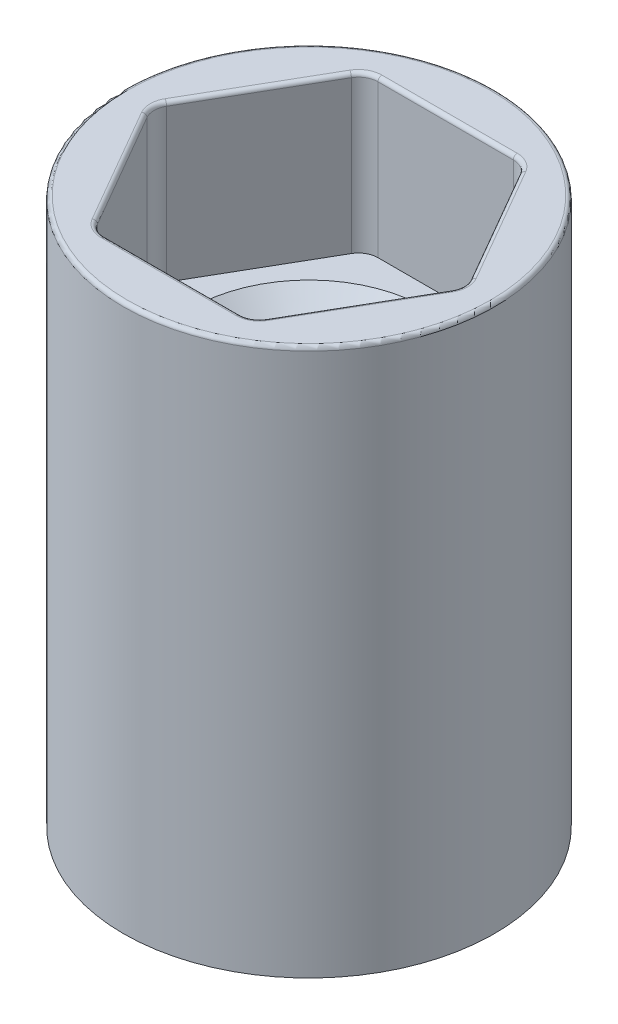
ISO-10303-21;
HEADER;
FILE_DESCRIPTION(('STEP AP214'),'2;1');
FILE_NAME('part.step','',(''),(''),'','','');
FILE_SCHEMA(('AUTOMOTIVE_DESIGN { 1 0 10303 214 1 1 1 1 }'));
ENDSEC;
DATA;
#1=APPLICATION_CONTEXT('core data for automotive mechanical design processes');
#2=APPLICATION_PROTOCOL_DEFINITION('international standard','automotive_design',2000,#1);
#3=PRODUCT_CONTEXT('',#1,'mechanical');
#4=PRODUCT('Part','Part','',(#3));
#5=PRODUCT_RELATED_PRODUCT_CATEGORY('part','',(#4));
#6=PRODUCT_DEFINITION_FORMATION('','',#4);
#7=PRODUCT_DEFINITION_CONTEXT('part definition',#1,'design');
#8=PRODUCT_DEFINITION('design','',#6,#7);
#9=PRODUCT_DEFINITION_SHAPE('','',#8);
#10=(LENGTH_UNIT() NAMED_UNIT(*) SI_UNIT(.MILLI.,.METRE.));
#11=(NAMED_UNIT(*) PLANE_ANGLE_UNIT() SI_UNIT($,.RADIAN.));
#12=(NAMED_UNIT(*) SI_UNIT($,.STERADIAN.) SOLID_ANGLE_UNIT());
#13=UNCERTAINTY_MEASURE_WITH_UNIT(LENGTH_MEASURE(1.E-05),#10,'distance_accuracy_value','');
#14=(GEOMETRIC_REPRESENTATION_CONTEXT(3) GLOBAL_UNCERTAINTY_ASSIGNED_CONTEXT((#13)) GLOBAL_UNIT_ASSIGNED_CONTEXT((#10,
#11,#12)) REPRESENTATION_CONTEXT('',''));
#15=CARTESIAN_POINT('',(0.,0.,0.));
#16=DIRECTION('',(0.,0.,1.));
#17=DIRECTION('',(1.,0.,0.));
#18=AXIS2_PLACEMENT_3D('',#15,#16,#17);
#19=CARTESIAN_POINT('',(0.,14.,0.));
#20=DIRECTION('',(0.,-1.,0.));
#21=DIRECTION('',(0.,0.,-1.));
#22=AXIS2_PLACEMENT_3D('',#19,#20,#21);
#23=CYLINDRICAL_SURFACE('',#22,2.5);
#24=CARTESIAN_POINT('',(0.,9.49999999999999,0.));
#25=DIRECTION('',(0.,1.,0.));
#26=DIRECTION('',(0.,0.,1.));
#27=AXIS2_PLACEMENT_3D('',#24,#25,#26);
#28=CIRCLE('',#27,2.5);
#29=CARTESIAN_POINT('',(0.,9.49999999999999,2.5));
#30=VERTEX_POINT('',#29);
#31=EDGE_CURVE('E223',#30,#30,#28,.T.);
#32=ORIENTED_EDGE('',*,*,#31,.T.);
#33=EDGE_LOOP('',(#32));
#34=FACE_BOUND('',#33,.T.);
#35=CARTESIAN_POINT('',(0.,0.500000000000006,0.));
#36=DIRECTION('',(0.,1.,0.));
#37=DIRECTION('',(0.,0.,1.));
#38=AXIS2_PLACEMENT_3D('',#35,#36,#37);
#39=CIRCLE('',#38,2.5);
#40=CARTESIAN_POINT('',(0.,0.500000000000006,2.5));
#41=VERTEX_POINT('',#40);
#42=EDGE_CURVE('E220',#41,#41,#39,.F.);
#43=ORIENTED_EDGE('',*,*,#42,.T.);
#44=EDGE_LOOP('',(#43));
#45=FACE_BOUND('',#44,.T.);
#46=ADVANCED_FACE('F36',(#34,#45),#23,.F.);
#47=CARTESIAN_POINT('',(0.,14.,0.));
#48=DIRECTION('',(0.,1.,0.));
#49=DIRECTION('',(0.,0.,1.));
#50=AXIS2_PLACEMENT_3D('',#47,#48,#49);
#51=PLANE('',#50);
#52=CARTESIAN_POINT('',(0.,14.,0.));
#53=DIRECTION('',(0.,1.,0.));
#54=DIRECTION('',(0.,0.,1.));
#55=AXIS2_PLACEMENT_3D('',#52,#53,#54);
#56=CIRCLE('',#55,4.65);
#57=CARTESIAN_POINT('',(0.,14.,4.65));
#58=VERTEX_POINT('',#57);
#59=EDGE_CURVE('E257',#58,#58,#56,.T.);
#60=ORIENTED_EDGE('',*,*,#59,.T.);
#61=EDGE_LOOP('',(#60));
#62=FACE_BOUND('',#61,.T.);
#63=DIRECTION('',(-0.5,0.,-0.866025403784439));
#64=VECTOR('',#63,1.);
#65=CARTESIAN_POINT('',(3.98371685740842,14.,-0.300000000000002));
#66=LINE('',#65,#64);
#67=CARTESIAN_POINT('',(2.25166604983954,14.,-3.3));
#68=VERTEX_POINT('',#67);
#69=CARTESIAN_POINT('',(3.98371685740842,14.,-0.300000000000002));
#70=VERTEX_POINT('',#69);
#71=EDGE_CURVE('E252',#68,#70,#66,.F.);
#72=ORIENTED_EDGE('',*,*,#71,.T.);
#73=CARTESIAN_POINT('',(3.46410161513776,14.,0.));
#74=DIRECTION('',(0.,1.,0.));
#75=DIRECTION('',(0.,0.,1.));
#76=AXIS2_PLACEMENT_3D('',#73,#74,#75);
#77=CIRCLE('',#76,0.6);
#78=CARTESIAN_POINT('',(3.98371685740842,14.,0.299999999999998));
#79=VERTEX_POINT('',#78);
#80=EDGE_CURVE('E254',#70,#79,#77,.F.);
#81=ORIENTED_EDGE('',*,*,#80,.T.);
#82=DIRECTION('',(0.499999999999999,0.,-0.866025403784439));
#83=VECTOR('',#82,1.);
#84=CARTESIAN_POINT('',(2.25166604983954,14.,3.3));
#85=LINE('',#84,#83);
#86=CARTESIAN_POINT('',(2.25166604983954,14.,3.3));
#87=VERTEX_POINT('',#86);
#88=EDGE_CURVE('E232',#79,#87,#85,.F.);
#89=ORIENTED_EDGE('',*,*,#88,.T.);
#90=CARTESIAN_POINT('',(1.73205080756888,14.,3.));
#91=DIRECTION('',(0.,1.,0.));
#92=DIRECTION('',(0.,0.,1.));
#93=AXIS2_PLACEMENT_3D('',#90,#91,#92);
#94=CIRCLE('',#93,0.6);
#95=CARTESIAN_POINT('',(1.73205080756888,14.,3.6));
#96=VERTEX_POINT('',#95);
#97=EDGE_CURVE('E234',#87,#96,#94,.F.);
#98=ORIENTED_EDGE('',*,*,#97,.T.);
#99=DIRECTION('',(1.,0.,0.));
#100=VECTOR('',#99,1.);
#101=CARTESIAN_POINT('',(-1.73205080756888,14.,3.6));
#102=LINE('',#101,#100);
#103=CARTESIAN_POINT('',(-1.73205080756888,14.,3.6));
#104=VERTEX_POINT('',#103);
#105=EDGE_CURVE('E236',#96,#104,#102,.F.);
#106=ORIENTED_EDGE('',*,*,#105,.T.);
#107=CARTESIAN_POINT('',(-1.73205080756888,14.,3.));
#108=DIRECTION('',(0.,1.,0.));
#109=DIRECTION('',(0.,0.,1.));
#110=AXIS2_PLACEMENT_3D('',#107,#108,#109);
#111=CIRCLE('',#110,0.6);
#112=CARTESIAN_POINT('',(-2.25166604983954,14.,3.3));
#113=VERTEX_POINT('',#112);
#114=EDGE_CURVE('E238',#104,#113,#111,.F.);
#115=ORIENTED_EDGE('',*,*,#114,.T.);
#116=DIRECTION('',(0.5,0.,0.866025403784439));
#117=VECTOR('',#116,1.);
#118=CARTESIAN_POINT('',(-3.98371685740842,14.,0.300000000000001));
#119=LINE('',#118,#117);
#120=CARTESIAN_POINT('',(-3.98371685740842,14.,0.300000000000001));
#121=VERTEX_POINT('',#120);
#122=EDGE_CURVE('E240',#113,#121,#119,.F.);
#123=ORIENTED_EDGE('',*,*,#122,.T.);
#124=CARTESIAN_POINT('',(-3.46410161513776,14.,0.));
#125=DIRECTION('',(0.,1.,0.));
#126=DIRECTION('',(0.,0.,1.));
#127=AXIS2_PLACEMENT_3D('',#124,#125,#126);
#128=CIRCLE('',#127,0.6);
#129=CARTESIAN_POINT('',(-3.98371685740842,14.,-0.299999999999999));
#130=VERTEX_POINT('',#129);
#131=EDGE_CURVE('E242',#121,#130,#128,.F.);
#132=ORIENTED_EDGE('',*,*,#131,.T.);
#133=DIRECTION('',(-0.5,0.,0.866025403784439));
#134=VECTOR('',#133,1.);
#135=CARTESIAN_POINT('',(-2.25166604983954,14.,-3.3));
#136=LINE('',#135,#134);
#137=CARTESIAN_POINT('',(-2.25166604983954,14.,-3.3));
#138=VERTEX_POINT('',#137);
#139=EDGE_CURVE('E244',#130,#138,#136,.F.);
#140=ORIENTED_EDGE('',*,*,#139,.T.);
#141=CARTESIAN_POINT('',(-1.73205080756888,14.,-3.));
#142=DIRECTION('',(0.,1.,0.));
#143=DIRECTION('',(0.,0.,1.));
#144=AXIS2_PLACEMENT_3D('',#141,#142,#143);
#145=CIRCLE('',#144,0.6);
#146=CARTESIAN_POINT('',(-1.73205080756888,14.,-3.6));
#147=VERTEX_POINT('',#146);
#148=EDGE_CURVE('E246',#138,#147,#145,.F.);
#149=ORIENTED_EDGE('',*,*,#148,.T.);
#150=DIRECTION('',(-1.,0.,0.));
#151=VECTOR('',#150,1.);
#152=CARTESIAN_POINT('',(1.73205080756888,14.,-3.6));
#153=LINE('',#152,#151);
#154=CARTESIAN_POINT('',(1.73205080756888,14.,-3.6));
#155=VERTEX_POINT('',#154);
#156=EDGE_CURVE('E248',#147,#155,#153,.F.);
#157=ORIENTED_EDGE('',*,*,#156,.T.);
#158=CARTESIAN_POINT('',(1.73205080756888,14.,-3.));
#159=DIRECTION('',(0.,1.,0.));
#160=DIRECTION('',(0.,0.,1.));
#161=AXIS2_PLACEMENT_3D('',#158,#159,#160);
#162=CIRCLE('',#161,0.6);
#163=EDGE_CURVE('E250',#155,#68,#162,.F.);
#164=ORIENTED_EDGE('',*,*,#163,.T.);
#165=EDGE_LOOP('',(#72,#81,#89,#98,#106,#115,#123,#132,#140,#149,#157,#164));
#166=FACE_BOUND('',#165,.T.);
#167=ADVANCED_FACE('F353',(#62,#166),#51,.T.);
#168=CARTESIAN_POINT('',(0.,0.,0.));
#169=DIRECTION('',(0.,1.,0.));
#170=DIRECTION('',(0.,0.,1.));
#171=AXIS2_PLACEMENT_3D('',#168,#169,#170);
#172=PLANE('',#171);
#173=CARTESIAN_POINT('',(0.,0.,0.));
#174=DIRECTION('',(0.,1.,0.));
#175=DIRECTION('',(0.,0.,1.));
#176=AXIS2_PLACEMENT_3D('',#173,#174,#175);
#177=CIRCLE('',#176,3.);
#178=CARTESIAN_POINT('',(0.,0.,3.));
#179=VERTEX_POINT('',#178);
#180=EDGE_CURVE('E229',#179,#179,#177,.T.);
#181=ORIENTED_EDGE('',*,*,#180,.T.);
#182=EDGE_LOOP('',(#181));
#183=FACE_BOUND('',#182,.T.);
#184=CARTESIAN_POINT('',(0.,0.,0.));
#185=DIRECTION('',(0.,1.,0.));
#186=DIRECTION('',(0.,0.,1.));
#187=AXIS2_PLACEMENT_3D('',#184,#185,#186);
#188=CIRCLE('',#187,4.75);
#189=CARTESIAN_POINT('',(0.,0.,4.75));
#190=VERTEX_POINT('',#189);
#191=EDGE_CURVE('E187',#190,#190,#188,.T.);
#192=ORIENTED_EDGE('',*,*,#191,.F.);
#193=EDGE_LOOP('',(#192));
#194=FACE_BOUND('',#193,.T.);
#195=ADVANCED_FACE('F351',(#183,#194),#172,.F.);
#196=CARTESIAN_POINT('',(0.,14.,0.));
#197=DIRECTION('',(0.,-1.,0.));
#198=DIRECTION('',(0.,0.,-1.));
#199=AXIS2_PLACEMENT_3D('',#196,#197,#198);
#200=CYLINDRICAL_SURFACE('',#199,4.75);
#201=CARTESIAN_POINT('',(0.,13.9,0.));
#202=DIRECTION('',(0.,1.,0.));
#203=DIRECTION('',(0.,0.,1.));
#204=AXIS2_PLACEMENT_3D('',#201,#202,#203);
#205=CIRCLE('',#204,4.75);
#206=CARTESIAN_POINT('',(0.,13.9,4.75));
#207=VERTEX_POINT('',#206);
#208=EDGE_CURVE('E260',#207,#207,#205,.F.);
#209=ORIENTED_EDGE('',*,*,#208,.T.);
#210=EDGE_LOOP('',(#209));
#211=FACE_BOUND('',#210,.T.);
#212=ORIENTED_EDGE('',*,*,#191,.T.);
#213=EDGE_LOOP('',(#212));
#214=FACE_BOUND('',#213,.T.);
#215=ADVANCED_FACE('F349',(#211,#214),#200,.T.);
#216=CARTESIAN_POINT('',(2.02072594216369,10.,3.5));
#217=DIRECTION('',(0.866025403784439,0.,0.5));
#218=DIRECTION('',(0.499999999999999,0.,-0.866025403784439));
#219=AXIS2_PLACEMENT_3D('',#216,#217,#218);
#220=PLANE('',#219);
#221=DIRECTION('',(0.,1.,0.));
#222=VECTOR('',#221,1.);
#223=CARTESIAN_POINT('',(2.1650635094611,14.,3.25));
#224=LINE('',#223,#222);
#225=CARTESIAN_POINT('',(2.1650635094611,10.,3.25));
#226=VERTEX_POINT('',#225);
#227=CARTESIAN_POINT('',(2.1650635094611,13.9,3.25));
#228=VERTEX_POINT('',#227);
#229=EDGE_CURVE('E176',#226,#228,#224,.T.);
#230=ORIENTED_EDGE('',*,*,#229,.T.);
#231=DIRECTION('',(0.499999999999999,0.,-0.866025403784439));
#232=VECTOR('',#231,1.);
#233=CARTESIAN_POINT('',(3.89711431702997,13.9,0.249999999999999));
#234=LINE('',#233,#232);
#235=CARTESIAN_POINT('',(3.89711431702997,13.9,0.249999999999998));
#236=VERTEX_POINT('',#235);
#237=EDGE_CURVE('E11',#228,#236,#234,.T.);
#238=ORIENTED_EDGE('',*,*,#237,.T.);
#239=DIRECTION('',(0.,1.,0.));
#240=VECTOR('',#239,1.);
#241=CARTESIAN_POINT('',(3.89711431702997,10.,0.249999999999998));
#242=LINE('',#241,#240);
#243=CARTESIAN_POINT('',(3.89711431702997,10.,0.249999999999999));
#244=VERTEX_POINT('',#243);
#245=EDGE_CURVE('E179',#236,#244,#242,.F.);
#246=ORIENTED_EDGE('',*,*,#245,.T.);
#247=DIRECTION('',(0.499999999999999,0.,-0.866025403784439));
#248=VECTOR('',#247,1.);
#249=CARTESIAN_POINT('',(2.02072594216369,10.,3.5));
#250=LINE('',#249,#248);
#251=EDGE_CURVE('E167',#226,#244,#250,.T.);
#252=ORIENTED_EDGE('',*,*,#251,.F.);
#253=EDGE_LOOP('',(#230,#238,#246,#252));
#254=FACE_BOUND('',#253,.T.);
#255=ADVANCED_FACE('F175',(#254),#220,.F.);
#256=CARTESIAN_POINT('',(-2.02072594216369,10.,3.5));
#257=DIRECTION('',(0.,0.,1.));
#258=DIRECTION('',(1.,0.,0.));
#259=AXIS2_PLACEMENT_3D('',#256,#257,#258);
#260=PLANE('',#259);
#261=DIRECTION('',(0.,1.,0.));
#262=VECTOR('',#261,1.);
#263=CARTESIAN_POINT('',(-1.73205080756888,14.,3.5));
#264=LINE('',#263,#262);
#265=CARTESIAN_POINT('',(-1.73205080756888,10.,3.5));
#266=VERTEX_POINT('',#265);
#267=CARTESIAN_POINT('',(-1.73205080756888,13.9,3.5));
#268=VERTEX_POINT('',#267);
#269=EDGE_CURVE('E183',#266,#268,#264,.T.);
#270=ORIENTED_EDGE('',*,*,#269,.T.);
#271=DIRECTION('',(1.,0.,0.));
#272=VECTOR('',#271,1.);
#273=CARTESIAN_POINT('',(1.73205080756888,13.9,3.5));
#274=LINE('',#273,#272);
#275=CARTESIAN_POINT('',(1.73205080756888,13.9,3.5));
#276=VERTEX_POINT('',#275);
#277=EDGE_CURVE('E60',#268,#276,#274,.T.);
#278=ORIENTED_EDGE('',*,*,#277,.T.);
#279=DIRECTION('',(0.,1.,0.));
#280=VECTOR('',#279,1.);
#281=CARTESIAN_POINT('',(1.73205080756888,10.,3.5));
#282=LINE('',#281,#280);
#283=CARTESIAN_POINT('',(1.73205080756888,10.,3.5));
#284=VERTEX_POINT('',#283);
#285=EDGE_CURVE('E185',#276,#284,#282,.F.);
#286=ORIENTED_EDGE('',*,*,#285,.T.);
#287=DIRECTION('',(1.,0.,0.));
#288=VECTOR('',#287,1.);
#289=CARTESIAN_POINT('',(-2.02072594216369,10.,3.5));
#290=LINE('',#289,#288);
#291=EDGE_CURVE('E170',#266,#284,#290,.T.);
#292=ORIENTED_EDGE('',*,*,#291,.F.);
#293=EDGE_LOOP('',(#270,#278,#286,#292));
#294=FACE_BOUND('',#293,.T.);
#295=ADVANCED_FACE('F373',(#294),#260,.F.);
#296=CARTESIAN_POINT('',(-4.04145188432738,10.,0.));
#297=DIRECTION('',(-0.866025403784439,0.,0.5));
#298=DIRECTION('',(0.5,0.,0.866025403784439));
#299=AXIS2_PLACEMENT_3D('',#296,#297,#298);
#300=PLANE('',#299);
#301=DIRECTION('',(0.,1.,0.));
#302=VECTOR('',#301,1.);
#303=CARTESIAN_POINT('',(-3.89711431702998,14.,0.250000000000001));
#304=LINE('',#303,#302);
#305=CARTESIAN_POINT('',(-3.89711431702998,10.,0.250000000000001));
#306=VERTEX_POINT('',#305);
#307=CARTESIAN_POINT('',(-3.89711431702998,13.9,0.250000000000001));
#308=VERTEX_POINT('',#307);
#309=EDGE_CURVE('E171',#306,#308,#304,.T.);
#310=ORIENTED_EDGE('',*,*,#309,.T.);
#311=DIRECTION('',(0.5,0.,0.866025403784439));
#312=VECTOR('',#311,1.);
#313=CARTESIAN_POINT('',(-2.1650635094611,13.9,3.25));
#314=LINE('',#313,#312);
#315=CARTESIAN_POINT('',(-2.1650635094611,13.9,3.25));
#316=VERTEX_POINT('',#315);
#317=EDGE_CURVE('E278',#308,#316,#314,.T.);
#318=ORIENTED_EDGE('',*,*,#317,.T.);
#319=DIRECTION('',(0.,1.,0.));
#320=VECTOR('',#319,1.);
#321=CARTESIAN_POINT('',(-2.1650635094611,10.,3.25));
#322=LINE('',#321,#320);
#323=CARTESIAN_POINT('',(-2.1650635094611,10.,3.25));
#324=VERTEX_POINT('',#323);
#325=EDGE_CURVE('E203',#316,#324,#322,.F.);
#326=ORIENTED_EDGE('',*,*,#325,.T.);
#327=DIRECTION('',(0.5,0.,0.866025403784439));
#328=VECTOR('',#327,1.);
#329=CARTESIAN_POINT('',(-4.04145188432738,10.,0.));
#330=LINE('',#329,#328);
#331=EDGE_CURVE('E337',#306,#324,#330,.T.);
#332=ORIENTED_EDGE('',*,*,#331,.F.);
#333=EDGE_LOOP('',(#310,#318,#326,#332));
#334=FACE_BOUND('',#333,.T.);
#335=ADVANCED_FACE('F334',(#334),#300,.F.);
#336=CARTESIAN_POINT('',(-2.02072594216369,10.,-3.5));
#337=DIRECTION('',(-0.866025403784439,0.,-0.5));
#338=DIRECTION('',(-0.5,0.,0.866025403784439));
#339=AXIS2_PLACEMENT_3D('',#336,#337,#338);
#340=PLANE('',#339);
#341=DIRECTION('',(0.,1.,0.));
#342=VECTOR('',#341,1.);
#343=CARTESIAN_POINT('',(-2.1650635094611,14.,-3.25));
#344=LINE('',#343,#342);
#345=CARTESIAN_POINT('',(-2.1650635094611,10.,-3.25));
#346=VERTEX_POINT('',#345);
#347=CARTESIAN_POINT('',(-2.1650635094611,13.9,-3.25));
#348=VERTEX_POINT('',#347);
#349=EDGE_CURVE('E205',#346,#348,#344,.T.);
#350=ORIENTED_EDGE('',*,*,#349,.T.);
#351=DIRECTION('',(-0.5,0.,0.866025403784439));
#352=VECTOR('',#351,1.);
#353=CARTESIAN_POINT('',(-3.89711431702997,13.9,-0.250000000000001));
#354=LINE('',#353,#352);
#355=CARTESIAN_POINT('',(-3.89711431702998,13.9,-0.249999999999999));
#356=VERTEX_POINT('',#355);
#357=EDGE_CURVE('E274',#348,#356,#354,.T.);
#358=ORIENTED_EDGE('',*,*,#357,.T.);
#359=DIRECTION('',(0.,1.,0.));
#360=VECTOR('',#359,1.);
#361=CARTESIAN_POINT('',(-3.89711431702998,10.,-0.249999999999999));
#362=LINE('',#361,#360);
#363=CARTESIAN_POINT('',(-3.89711431702998,10.,-0.249999999999999));
#364=VERTEX_POINT('',#363);
#365=EDGE_CURVE('E208',#356,#364,#362,.F.);
#366=ORIENTED_EDGE('',*,*,#365,.T.);
#367=DIRECTION('',(-0.5,0.,0.866025403784439));
#368=VECTOR('',#367,1.);
#369=CARTESIAN_POINT('',(-2.02072594216369,10.,-3.5));
#370=LINE('',#369,#368);
#371=EDGE_CURVE('E339',#346,#364,#370,.T.);
#372=ORIENTED_EDGE('',*,*,#371,.F.);
#373=EDGE_LOOP('',(#350,#358,#366,#372));
#374=FACE_BOUND('',#373,.T.);
#375=ADVANCED_FACE('F381',(#374),#340,.F.);
#376=CARTESIAN_POINT('',(2.02072594216369,10.,-3.5));
#377=DIRECTION('',(0.,0.,-1.));
#378=DIRECTION('',(-1.,0.,0.));
#379=AXIS2_PLACEMENT_3D('',#376,#377,#378);
#380=PLANE('',#379);
#381=DIRECTION('',(0.,1.,0.));
#382=VECTOR('',#381,1.);
#383=CARTESIAN_POINT('',(1.73205080756888,14.,-3.5));
#384=LINE('',#383,#382);
#385=CARTESIAN_POINT('',(1.73205080756888,10.,-3.5));
#386=VERTEX_POINT('',#385);
#387=CARTESIAN_POINT('',(1.73205080756888,13.9,-3.5));
#388=VERTEX_POINT('',#387);
#389=EDGE_CURVE('E217',#386,#388,#384,.T.);
#390=ORIENTED_EDGE('',*,*,#389,.T.);
#391=DIRECTION('',(-1.,0.,0.));
#392=VECTOR('',#391,1.);
#393=CARTESIAN_POINT('',(-1.73205080756888,13.9,-3.5));
#394=LINE('',#393,#392);
#395=CARTESIAN_POINT('',(-1.73205080756888,13.9,-3.5));
#396=VERTEX_POINT('',#395);
#397=EDGE_CURVE('E270',#388,#396,#394,.T.);
#398=ORIENTED_EDGE('',*,*,#397,.T.);
#399=DIRECTION('',(0.,1.,0.));
#400=VECTOR('',#399,1.);
#401=CARTESIAN_POINT('',(-1.73205080756888,10.,-3.5));
#402=LINE('',#401,#400);
#403=CARTESIAN_POINT('',(-1.73205080756888,10.,-3.5));
#404=VERTEX_POINT('',#403);
#405=EDGE_CURVE('E215',#396,#404,#402,.F.);
#406=ORIENTED_EDGE('',*,*,#405,.T.);
#407=DIRECTION('',(-1.,0.,0.));
#408=VECTOR('',#407,1.);
#409=CARTESIAN_POINT('',(2.02072594216369,10.,-3.5));
#410=LINE('',#409,#408);
#411=EDGE_CURVE('E343',#386,#404,#410,.T.);
#412=ORIENTED_EDGE('',*,*,#411,.F.);
#413=EDGE_LOOP('',(#390,#398,#406,#412));
#414=FACE_BOUND('',#413,.T.);
#415=ADVANCED_FACE('F377',(#414),#380,.F.);
#416=CARTESIAN_POINT('',(4.04145188432738,10.,0.));
#417=DIRECTION('',(0.866025403784438,0.,-0.5));
#418=DIRECTION('',(-0.5,0.,-0.866025403784439));
#419=AXIS2_PLACEMENT_3D('',#416,#417,#418);
#420=PLANE('',#419);
#421=DIRECTION('',(0.,1.,0.));
#422=VECTOR('',#421,1.);
#423=CARTESIAN_POINT('',(3.89711431702997,14.,-0.250000000000002));
#424=LINE('',#423,#422);
#425=CARTESIAN_POINT('',(3.89711431702997,10.,-0.250000000000002));
#426=VERTEX_POINT('',#425);
#427=CARTESIAN_POINT('',(3.89711431702997,13.9,-0.250000000000002));
#428=VERTEX_POINT('',#427);
#429=EDGE_CURVE('E212',#426,#428,#424,.T.);
#430=ORIENTED_EDGE('',*,*,#429,.T.);
#431=DIRECTION('',(-0.5,0.,-0.866025403784439));
#432=VECTOR('',#431,1.);
#433=CARTESIAN_POINT('',(2.16506350946109,13.9,-3.25));
#434=LINE('',#433,#432);
#435=CARTESIAN_POINT('',(2.1650635094611,13.9,-3.25));
#436=VERTEX_POINT('',#435);
#437=EDGE_CURVE('E266',#428,#436,#434,.T.);
#438=ORIENTED_EDGE('',*,*,#437,.T.);
#439=DIRECTION('',(0.,1.,0.));
#440=VECTOR('',#439,1.);
#441=CARTESIAN_POINT('',(2.1650635094611,10.,-3.25));
#442=LINE('',#441,#440);
#443=CARTESIAN_POINT('',(2.1650635094611,10.,-3.25));
#444=VERTEX_POINT('',#443);
#445=EDGE_CURVE('E210',#436,#444,#442,.F.);
#446=ORIENTED_EDGE('',*,*,#445,.T.);
#447=DIRECTION('',(-0.5,0.,-0.866025403784438));
#448=VECTOR('',#447,1.);
#449=CARTESIAN_POINT('',(4.04145188432738,10.,0.));
#450=LINE('',#449,#448);
#451=EDGE_CURVE('E180',#426,#444,#450,.T.);
#452=ORIENTED_EDGE('',*,*,#451,.F.);
#453=EDGE_LOOP('',(#430,#438,#446,#452));
#454=FACE_BOUND('',#453,.T.);
#455=ADVANCED_FACE('F374',(#454),#420,.F.);
#456=CARTESIAN_POINT('',(0.,10.,0.));
#457=DIRECTION('',(0.,1.,0.));
#458=DIRECTION('',(0.,0.,1.));
#459=AXIS2_PLACEMENT_3D('',#456,#457,#458);
#460=PLANE('',#459);
#461=CARTESIAN_POINT('',(0.,10.,0.));
#462=DIRECTION('',(0.,1.,0.));
#463=DIRECTION('',(0.,0.,1.));
#464=AXIS2_PLACEMENT_3D('',#461,#462,#463);
#465=CIRCLE('',#464,3.00000000000001);
#466=CARTESIAN_POINT('',(0.,10.,3.00000000000001));
#467=VERTEX_POINT('',#466);
#468=EDGE_CURVE('E226',#467,#467,#465,.F.);
#469=ORIENTED_EDGE('',*,*,#468,.T.);
#470=EDGE_LOOP('',(#469));
#471=FACE_BOUND('',#470,.T.);
#472=ORIENTED_EDGE('',*,*,#291,.T.);
#473=CARTESIAN_POINT('',(1.73205080756888,10.,3.));
#474=DIRECTION('',(0.,1.,0.));
#475=DIRECTION('',(0.,0.,1.));
#476=AXIS2_PLACEMENT_3D('',#473,#474,#475);
#477=CIRCLE('',#476,0.5);
#478=EDGE_CURVE('E164',#284,#226,#477,.T.);
#479=ORIENTED_EDGE('',*,*,#478,.T.);
#480=ORIENTED_EDGE('',*,*,#251,.T.);
#481=CARTESIAN_POINT('',(3.46410161513776,10.,0.));
#482=DIRECTION('',(0.,1.,0.));
#483=DIRECTION('',(0.,0.,1.));
#484=AXIS2_PLACEMENT_3D('',#481,#482,#483);
#485=CIRCLE('',#484,0.5);
#486=EDGE_CURVE('E196',#244,#426,#485,.T.);
#487=ORIENTED_EDGE('',*,*,#486,.T.);
#488=ORIENTED_EDGE('',*,*,#451,.T.);
#489=CARTESIAN_POINT('',(1.73205080756888,10.,-3.));
#490=DIRECTION('',(0.,1.,0.));
#491=DIRECTION('',(0.,0.,1.));
#492=AXIS2_PLACEMENT_3D('',#489,#490,#491);
#493=CIRCLE('',#492,0.5);
#494=EDGE_CURVE('E194',#444,#386,#493,.T.);
#495=ORIENTED_EDGE('',*,*,#494,.T.);
#496=ORIENTED_EDGE('',*,*,#411,.T.);
#497=CARTESIAN_POINT('',(-1.73205080756888,10.,-3.));
#498=DIRECTION('',(0.,1.,0.));
#499=DIRECTION('',(0.,0.,1.));
#500=AXIS2_PLACEMENT_3D('',#497,#498,#499);
#501=CIRCLE('',#500,0.5);
#502=EDGE_CURVE('E192',#404,#346,#501,.T.);
#503=ORIENTED_EDGE('',*,*,#502,.T.);
#504=ORIENTED_EDGE('',*,*,#371,.T.);
#505=CARTESIAN_POINT('',(-3.46410161513776,10.,0.));
#506=DIRECTION('',(0.,1.,0.));
#507=DIRECTION('',(0.,0.,1.));
#508=AXIS2_PLACEMENT_3D('',#505,#506,#507);
#509=CIRCLE('',#508,0.5);
#510=EDGE_CURVE('E198',#364,#306,#509,.T.);
#511=ORIENTED_EDGE('',*,*,#510,.T.);
#512=ORIENTED_EDGE('',*,*,#331,.T.);
#513=CARTESIAN_POINT('',(-1.73205080756888,10.,3.));
#514=DIRECTION('',(0.,1.,0.));
#515=DIRECTION('',(0.,0.,1.));
#516=AXIS2_PLACEMENT_3D('',#513,#514,#515);
#517=CIRCLE('',#516,0.5);
#518=EDGE_CURVE('E172',#324,#266,#517,.T.);
#519=ORIENTED_EDGE('',*,*,#518,.T.);
#520=EDGE_LOOP('',(#472,#479,#480,#487,#488,#495,#496,#503,#504,#511,#512,#519));
#521=FACE_BOUND('',#520,.T.);
#522=ADVANCED_FACE('F166',(#471,#521),#460,.T.);
#523=CARTESIAN_POINT('',(1.73205080756888,10.,3.));
#524=DIRECTION('',(0.,-1.,0.));
#525=DIRECTION('',(0.,0.,-1.));
#526=AXIS2_PLACEMENT_3D('',#523,#524,#525);
#527=CYLINDRICAL_SURFACE('',#526,0.5);
#528=ORIENTED_EDGE('',*,*,#285,.F.);
#529=CARTESIAN_POINT('',(1.73205080756888,13.9,3.));
#530=DIRECTION('',(0.,1.,0.));
#531=DIRECTION('',(0.,0.,1.));
#532=AXIS2_PLACEMENT_3D('',#529,#530,#531);
#533=CIRCLE('',#532,0.5);
#534=EDGE_CURVE('E45',#276,#228,#533,.T.);
#535=ORIENTED_EDGE('',*,*,#534,.T.);
#536=ORIENTED_EDGE('',*,*,#229,.F.);
#537=ORIENTED_EDGE('',*,*,#478,.F.);
#538=EDGE_LOOP('',(#528,#535,#536,#537));
#539=FACE_BOUND('',#538,.T.);
#540=ADVANCED_FACE('F182',(#539),#527,.F.);
#541=CARTESIAN_POINT('',(-1.73205080756888,10.,3.));
#542=DIRECTION('',(0.,-1.,0.));
#543=DIRECTION('',(0.,0.,-1.));
#544=AXIS2_PLACEMENT_3D('',#541,#542,#543);
#545=CYLINDRICAL_SURFACE('',#544,0.5);
#546=ORIENTED_EDGE('',*,*,#325,.F.);
#547=CARTESIAN_POINT('',(-1.73205080756888,13.9,3.));
#548=DIRECTION('',(0.,1.,0.));
#549=DIRECTION('',(0.,0.,1.));
#550=AXIS2_PLACEMENT_3D('',#547,#548,#549);
#551=CIRCLE('',#550,0.5);
#552=EDGE_CURVE('E280',#316,#268,#551,.T.);
#553=ORIENTED_EDGE('',*,*,#552,.T.);
#554=ORIENTED_EDGE('',*,*,#269,.F.);
#555=ORIENTED_EDGE('',*,*,#518,.F.);
#556=EDGE_LOOP('',(#546,#553,#554,#555));
#557=FACE_BOUND('',#556,.T.);
#558=ADVANCED_FACE('F395',(#557),#545,.F.);
#559=CARTESIAN_POINT('',(-3.46410161513776,10.,0.));
#560=DIRECTION('',(0.,-1.,0.));
#561=DIRECTION('',(0.,0.,-1.));
#562=AXIS2_PLACEMENT_3D('',#559,#560,#561);
#563=CYLINDRICAL_SURFACE('',#562,0.5);
#564=ORIENTED_EDGE('',*,*,#365,.F.);
#565=CARTESIAN_POINT('',(-3.46410161513776,13.9,0.));
#566=DIRECTION('',(0.,1.,0.));
#567=DIRECTION('',(0.,0.,1.));
#568=AXIS2_PLACEMENT_3D('',#565,#566,#567);
#569=CIRCLE('',#568,0.5);
#570=EDGE_CURVE('E276',#356,#308,#569,.T.);
#571=ORIENTED_EDGE('',*,*,#570,.T.);
#572=ORIENTED_EDGE('',*,*,#309,.F.);
#573=ORIENTED_EDGE('',*,*,#510,.F.);
#574=EDGE_LOOP('',(#564,#571,#572,#573));
#575=FACE_BOUND('',#574,.T.);
#576=ADVANCED_FACE('F330',(#575),#563,.F.);
#577=CARTESIAN_POINT('',(3.46410161513776,10.,0.));
#578=DIRECTION('',(0.,-1.,0.));
#579=DIRECTION('',(0.,0.,-1.));
#580=AXIS2_PLACEMENT_3D('',#577,#578,#579);
#581=CYLINDRICAL_SURFACE('',#580,0.5);
#582=ORIENTED_EDGE('',*,*,#245,.F.);
#583=CARTESIAN_POINT('',(3.46410161513776,13.9,0.));
#584=DIRECTION('',(0.,1.,0.));
#585=DIRECTION('',(0.,0.,1.));
#586=AXIS2_PLACEMENT_3D('',#583,#584,#585);
#587=CIRCLE('',#586,0.5);
#588=EDGE_CURVE('E263',#236,#428,#587,.T.);
#589=ORIENTED_EDGE('',*,*,#588,.T.);
#590=ORIENTED_EDGE('',*,*,#429,.F.);
#591=ORIENTED_EDGE('',*,*,#486,.F.);
#592=EDGE_LOOP('',(#582,#589,#590,#591));
#593=FACE_BOUND('',#592,.T.);
#594=ADVANCED_FACE('F551',(#593),#581,.F.);
#595=CARTESIAN_POINT('',(1.73205080756888,10.,-3.));
#596=DIRECTION('',(0.,-1.,0.));
#597=DIRECTION('',(0.,0.,-1.));
#598=AXIS2_PLACEMENT_3D('',#595,#596,#597);
#599=CYLINDRICAL_SURFACE('',#598,0.5);
#600=ORIENTED_EDGE('',*,*,#445,.F.);
#601=CARTESIAN_POINT('',(1.73205080756888,13.9,-3.));
#602=DIRECTION('',(0.,1.,0.));
#603=DIRECTION('',(0.,0.,1.));
#604=AXIS2_PLACEMENT_3D('',#601,#602,#603);
#605=CIRCLE('',#604,0.5);
#606=EDGE_CURVE('E268',#436,#388,#605,.T.);
#607=ORIENTED_EDGE('',*,*,#606,.T.);
#608=ORIENTED_EDGE('',*,*,#389,.F.);
#609=ORIENTED_EDGE('',*,*,#494,.F.);
#610=EDGE_LOOP('',(#600,#607,#608,#609));
#611=FACE_BOUND('',#610,.T.);
#612=ADVANCED_FACE('F413',(#611),#599,.F.);
#613=CARTESIAN_POINT('',(-1.73205080756888,10.,-3.));
#614=DIRECTION('',(0.,-1.,0.));
#615=DIRECTION('',(0.,0.,-1.));
#616=AXIS2_PLACEMENT_3D('',#613,#614,#615);
#617=CYLINDRICAL_SURFACE('',#616,0.5);
#618=ORIENTED_EDGE('',*,*,#405,.F.);
#619=CARTESIAN_POINT('',(-1.73205080756888,13.9,-3.));
#620=DIRECTION('',(0.,1.,0.));
#621=DIRECTION('',(0.,0.,1.));
#622=AXIS2_PLACEMENT_3D('',#619,#620,#621);
#623=CIRCLE('',#622,0.5);
#624=EDGE_CURVE('E272',#396,#348,#623,.T.);
#625=ORIENTED_EDGE('',*,*,#624,.T.);
#626=ORIENTED_EDGE('',*,*,#349,.F.);
#627=ORIENTED_EDGE('',*,*,#502,.F.);
#628=EDGE_LOOP('',(#618,#625,#626,#627));
#629=FACE_BOUND('',#628,.T.);
#630=ADVANCED_FACE('F403',(#629),#617,.F.);
#631=CARTESIAN_POINT('',(0.,9.49999999999999,0.));
#632=DIRECTION('',(0.,1.,0.));
#633=DIRECTION('',(0.,0.,1.));
#634=AXIS2_PLACEMENT_3D('',#631,#632,#633);
#635=CONICAL_SURFACE('',#634,2.5,0.78539816339745);
#636=ORIENTED_EDGE('',*,*,#468,.F.);
#637=EDGE_LOOP('',(#636));
#638=FACE_BOUND('',#637,.T.);
#639=ORIENTED_EDGE('',*,*,#31,.F.);
#640=EDGE_LOOP('',(#639));
#641=FACE_BOUND('',#640,.T.);
#642=ADVANCED_FACE('F399',(#638,#641),#635,.F.);
#643=CARTESIAN_POINT('',(0.,0.,0.));
#644=DIRECTION('',(0.,-1.,0.));
#645=DIRECTION('',(0.,0.,-1.));
#646=AXIS2_PLACEMENT_3D('',#643,#644,#645);
#647=CONICAL_SURFACE('',#646,3.,0.785398163397447);
#648=ORIENTED_EDGE('',*,*,#42,.F.);
#649=EDGE_LOOP('',(#648));
#650=FACE_BOUND('',#649,.T.);
#651=ORIENTED_EDGE('',*,*,#180,.F.);
#652=EDGE_LOOP('',(#651));
#653=FACE_BOUND('',#652,.T.);
#654=ADVANCED_FACE('F402',(#650,#653),#647,.F.);
#655=CARTESIAN_POINT('',(0.,13.9,0.));
#656=DIRECTION('',(0.,1.,0.));
#657=DIRECTION('',(0.,0.,1.));
#658=AXIS2_PLACEMENT_3D('',#655,#656,#657);
#659=TOROIDAL_SURFACE('',#658,4.65,0.1);
#660=ORIENTED_EDGE('',*,*,#208,.F.);
#661=EDGE_LOOP('',(#660));
#662=FACE_BOUND('',#661,.T.);
#663=ORIENTED_EDGE('',*,*,#59,.F.);
#664=EDGE_LOOP('',(#663));
#665=FACE_BOUND('',#664,.T.);
#666=ADVANCED_FACE('F410',(#662,#665),#659,.T.);
#667=CARTESIAN_POINT('',(-3.46410161513776,13.9,0.));
#668=DIRECTION('',(0.,1.,0.));
#669=DIRECTION('',(0.,0.,1.));
#670=AXIS2_PLACEMENT_3D('',#667,#668,#669);
#671=TOROIDAL_SURFACE('',#670,0.6,0.1);
#672=CARTESIAN_POINT('',(-3.98371685740842,13.9,0.300000000000001));
#673=DIRECTION('',(0.500000000000001,0.,0.866025403784438));
#674=DIRECTION('',(0.866025403784438,0.,-0.500000000000001));
#675=AXIS2_PLACEMENT_3D('',#672,#673,#674);
#676=CIRCLE('',#675,0.1);
#677=EDGE_CURVE('E311',#308,#121,#676,.T.);
#678=ORIENTED_EDGE('',*,*,#677,.F.);
#679=ORIENTED_EDGE('',*,*,#570,.F.);
#680=CARTESIAN_POINT('',(-3.98371685740842,13.9,-0.299999999999999));
#681=DIRECTION('',(0.499999999999996,0.,-0.866025403784441));
#682=DIRECTION('',(-0.866025403784441,0.,-0.499999999999996));
#683=AXIS2_PLACEMENT_3D('',#680,#681,#682);
#684=CIRCLE('',#683,0.1);
#685=EDGE_CURVE('E40',#130,#356,#684,.T.);
#686=ORIENTED_EDGE('',*,*,#685,.F.);
#687=ORIENTED_EDGE('',*,*,#131,.F.);
#688=EDGE_LOOP('',(#678,#679,#686,#687));
#689=FACE_BOUND('',#688,.T.);
#690=ADVANCED_FACE('F38',(#689),#671,.T.);
#691=CARTESIAN_POINT('',(-2.10732848254213,13.9,-3.55));
#692=DIRECTION('',(0.5,0.,-0.866025403784439));
#693=DIRECTION('',(-0.866025403784439,0.,-0.5));
#694=AXIS2_PLACEMENT_3D('',#691,#692,#693);
#695=CYLINDRICAL_SURFACE('',#694,0.1);
#696=ORIENTED_EDGE('',*,*,#685,.T.);
#697=ORIENTED_EDGE('',*,*,#357,.F.);
#698=CARTESIAN_POINT('',(-2.25166604983954,13.9,-3.3));
#699=DIRECTION('',(0.5,0.,-0.866025403784439));
#700=DIRECTION('',(-0.866025403784439,0.,-0.5));
#701=AXIS2_PLACEMENT_3D('',#698,#699,#700);
#702=CIRCLE('',#701,0.1);
#703=EDGE_CURVE('E309',#138,#348,#702,.T.);
#704=ORIENTED_EDGE('',*,*,#703,.F.);
#705=ORIENTED_EDGE('',*,*,#139,.F.);
#706=EDGE_LOOP('',(#696,#697,#704,#705));
#707=FACE_BOUND('',#706,.T.);
#708=ADVANCED_FACE('F322',(#707),#695,.T.);
#709=CARTESIAN_POINT('',(-4.12805442470583,13.9,0.0500000000000009));
#710=DIRECTION('',(-0.5,0.,-0.866025403784439));
#711=DIRECTION('',(-0.866025403784439,0.,0.5));
#712=AXIS2_PLACEMENT_3D('',#709,#710,#711);
#713=CYLINDRICAL_SURFACE('',#712,0.1);
#714=ORIENTED_EDGE('',*,*,#677,.T.);
#715=ORIENTED_EDGE('',*,*,#122,.F.);
#716=CARTESIAN_POINT('',(-2.25166604983954,13.9,3.3));
#717=DIRECTION('',(0.500000000000002,0.,0.866025403784438));
#718=DIRECTION('',(0.866025403784438,0.,-0.500000000000002));
#719=AXIS2_PLACEMENT_3D('',#716,#717,#718);
#720=CIRCLE('',#719,0.1);
#721=EDGE_CURVE('E306',#316,#113,#720,.T.);
#722=ORIENTED_EDGE('',*,*,#721,.F.);
#723=ORIENTED_EDGE('',*,*,#317,.F.);
#724=EDGE_LOOP('',(#714,#715,#722,#723));
#725=FACE_BOUND('',#724,.T.);
#726=ADVANCED_FACE('F456',(#725),#713,.T.);
#727=CARTESIAN_POINT('',(-1.73205080756888,13.9,-3.));
#728=DIRECTION('',(0.,1.,0.));
#729=DIRECTION('',(0.,0.,1.));
#730=AXIS2_PLACEMENT_3D('',#727,#728,#729);
#731=TOROIDAL_SURFACE('',#730,0.6,0.1);
#732=ORIENTED_EDGE('',*,*,#703,.T.);
#733=ORIENTED_EDGE('',*,*,#624,.F.);
#734=CARTESIAN_POINT('',(-1.73205080756888,13.9,-3.6));
#735=DIRECTION('',(1.,0.,0.));
#736=DIRECTION('',(0.,0.,-1.));
#737=AXIS2_PLACEMENT_3D('',#734,#735,#736);
#738=CIRCLE('',#737,0.1);
#739=EDGE_CURVE('E303',#147,#396,#738,.T.);
#740=ORIENTED_EDGE('',*,*,#739,.F.);
#741=ORIENTED_EDGE('',*,*,#148,.F.);
#742=EDGE_LOOP('',(#732,#733,#740,#741));
#743=FACE_BOUND('',#742,.T.);
#744=ADVANCED_FACE('F452',(#743),#731,.T.);
#745=CARTESIAN_POINT('',(-1.73205080756888,13.9,3.));
#746=DIRECTION('',(0.,1.,0.));
#747=DIRECTION('',(0.,0.,1.));
#748=AXIS2_PLACEMENT_3D('',#745,#746,#747);
#749=TOROIDAL_SURFACE('',#748,0.6,0.1);
#750=ORIENTED_EDGE('',*,*,#721,.T.);
#751=ORIENTED_EDGE('',*,*,#114,.F.);
#752=CARTESIAN_POINT('',(-1.73205080756888,13.9,3.6));
#753=DIRECTION('',(1.,0.,0.));
#754=DIRECTION('',(0.,0.,-1.));
#755=AXIS2_PLACEMENT_3D('',#752,#753,#754);
#756=CIRCLE('',#755,0.1);
#757=EDGE_CURVE('E300',#268,#104,#756,.T.);
#758=ORIENTED_EDGE('',*,*,#757,.F.);
#759=ORIENTED_EDGE('',*,*,#552,.F.);
#760=EDGE_LOOP('',(#750,#751,#758,#759));
#761=FACE_BOUND('',#760,.T.);
#762=ADVANCED_FACE('F448',(#761),#749,.T.);
#763=CARTESIAN_POINT('',(2.02072594216369,13.9,-3.6));
#764=DIRECTION('',(1.,0.,0.));
#765=DIRECTION('',(0.,0.,-1.));
#766=AXIS2_PLACEMENT_3D('',#763,#764,#765);
#767=CYLINDRICAL_SURFACE('',#766,0.1);
#768=ORIENTED_EDGE('',*,*,#739,.T.);
#769=ORIENTED_EDGE('',*,*,#397,.F.);
#770=CARTESIAN_POINT('',(1.73205080756888,13.9,-3.6));
#771=DIRECTION('',(1.,0.,0.));
#772=DIRECTION('',(0.,0.,-1.));
#773=AXIS2_PLACEMENT_3D('',#770,#771,#772);
#774=CIRCLE('',#773,0.1);
#775=EDGE_CURVE('E297',#155,#388,#774,.T.);
#776=ORIENTED_EDGE('',*,*,#775,.F.);
#777=ORIENTED_EDGE('',*,*,#156,.F.);
#778=EDGE_LOOP('',(#768,#769,#776,#777));
#779=FACE_BOUND('',#778,.T.);
#780=ADVANCED_FACE('F444',(#779),#767,.T.);
#781=CARTESIAN_POINT('',(-2.02072594216369,13.9,3.6));
#782=DIRECTION('',(-1.,0.,0.));
#783=DIRECTION('',(0.,0.,1.));
#784=AXIS2_PLACEMENT_3D('',#781,#782,#783);
#785=CYLINDRICAL_SURFACE('',#784,0.1);
#786=ORIENTED_EDGE('',*,*,#757,.T.);
#787=ORIENTED_EDGE('',*,*,#105,.F.);
#788=CARTESIAN_POINT('',(1.73205080756888,13.9,3.6));
#789=DIRECTION('',(1.,0.,0.));
#790=DIRECTION('',(0.,0.,-1.));
#791=AXIS2_PLACEMENT_3D('',#788,#789,#790);
#792=CIRCLE('',#791,0.1);
#793=EDGE_CURVE('E294',#276,#96,#792,.T.);
#794=ORIENTED_EDGE('',*,*,#793,.F.);
#795=ORIENTED_EDGE('',*,*,#277,.F.);
#796=EDGE_LOOP('',(#786,#787,#794,#795));
#797=FACE_BOUND('',#796,.T.);
#798=ADVANCED_FACE('F440',(#797),#785,.T.);
#799=CARTESIAN_POINT('',(1.73205080756888,13.9,-3.));
#800=DIRECTION('',(0.,1.,0.));
#801=DIRECTION('',(0.,0.,1.));
#802=AXIS2_PLACEMENT_3D('',#799,#800,#801);
#803=TOROIDAL_SURFACE('',#802,0.6,0.1);
#804=ORIENTED_EDGE('',*,*,#775,.T.);
#805=ORIENTED_EDGE('',*,*,#606,.F.);
#806=CARTESIAN_POINT('',(2.25166604983954,13.9,-3.3));
#807=DIRECTION('',(0.500000000000002,0.,0.866025403784438));
#808=DIRECTION('',(0.866025403784438,0.,-0.500000000000002));
#809=AXIS2_PLACEMENT_3D('',#806,#807,#808);
#810=CIRCLE('',#809,0.1);
#811=EDGE_CURVE('E291',#68,#436,#810,.T.);
#812=ORIENTED_EDGE('',*,*,#811,.F.);
#813=ORIENTED_EDGE('',*,*,#163,.F.);
#814=EDGE_LOOP('',(#804,#805,#812,#813));
#815=FACE_BOUND('',#814,.T.);
#816=ADVANCED_FACE('F436',(#815),#803,.T.);
#817=CARTESIAN_POINT('',(1.73205080756888,13.9,3.));
#818=DIRECTION('',(0.,1.,0.));
#819=DIRECTION('',(0.,0.,1.));
#820=AXIS2_PLACEMENT_3D('',#817,#818,#819);
#821=TOROIDAL_SURFACE('',#820,0.6,0.1);
#822=ORIENTED_EDGE('',*,*,#793,.T.);
#823=ORIENTED_EDGE('',*,*,#97,.F.);
#824=CARTESIAN_POINT('',(2.25166604983954,13.9,3.3));
#825=DIRECTION('',(0.500000000000002,0.,-0.866025403784438));
#826=DIRECTION('',(-0.866025403784438,0.,-0.500000000000002));
#827=AXIS2_PLACEMENT_3D('',#824,#825,#826);
#828=CIRCLE('',#827,0.1);
#829=EDGE_CURVE('E288',#228,#87,#828,.T.);
#830=ORIENTED_EDGE('',*,*,#829,.F.);
#831=ORIENTED_EDGE('',*,*,#534,.F.);
#832=EDGE_LOOP('',(#822,#823,#830,#831));
#833=FACE_BOUND('',#832,.T.);
#834=ADVANCED_FACE('F432',(#833),#821,.T.);
#835=CARTESIAN_POINT('',(4.12805442470582,13.9,-0.0500000000000018));
#836=DIRECTION('',(0.5,0.,0.866025403784439));
#837=DIRECTION('',(0.866025403784438,0.,-0.5));
#838=AXIS2_PLACEMENT_3D('',#835,#836,#837);
#839=CYLINDRICAL_SURFACE('',#838,0.1);
#840=ORIENTED_EDGE('',*,*,#811,.T.);
#841=ORIENTED_EDGE('',*,*,#437,.F.);
#842=CARTESIAN_POINT('',(3.98371685740842,13.9,-0.300000000000002));
#843=DIRECTION('',(0.5,0.,0.866025403784439));
#844=DIRECTION('',(0.866025403784439,0.,-0.5));
#845=AXIS2_PLACEMENT_3D('',#842,#843,#844);
#846=CIRCLE('',#845,0.1);
#847=EDGE_CURVE('E286',#70,#428,#846,.T.);
#848=ORIENTED_EDGE('',*,*,#847,.F.);
#849=ORIENTED_EDGE('',*,*,#71,.F.);
#850=EDGE_LOOP('',(#840,#841,#848,#849));
#851=FACE_BOUND('',#850,.T.);
#852=ADVANCED_FACE('F428',(#851),#839,.T.);
#853=CARTESIAN_POINT('',(2.10732848254214,13.9,3.55));
#854=DIRECTION('',(-0.499999999999999,0.,0.866025403784439));
#855=DIRECTION('',(0.866025403784439,0.,0.5));
#856=AXIS2_PLACEMENT_3D('',#853,#854,#855);
#857=CYLINDRICAL_SURFACE('',#856,0.1);
#858=ORIENTED_EDGE('',*,*,#829,.T.);
#859=ORIENTED_EDGE('',*,*,#88,.F.);
#860=CARTESIAN_POINT('',(3.98371685740842,13.9,0.299999999999998));
#861=DIRECTION('',(0.500000000000001,0.,-0.866025403784438));
#862=DIRECTION('',(-0.866025403784438,0.,-0.500000000000001));
#863=AXIS2_PLACEMENT_3D('',#860,#861,#862);
#864=CIRCLE('',#863,0.1);
#865=EDGE_CURVE('E284',#236,#79,#864,.T.);
#866=ORIENTED_EDGE('',*,*,#865,.F.);
#867=ORIENTED_EDGE('',*,*,#237,.F.);
#868=EDGE_LOOP('',(#858,#859,#866,#867));
#869=FACE_BOUND('',#868,.T.);
#870=ADVANCED_FACE('F424',(#869),#857,.T.);
#871=CARTESIAN_POINT('',(3.46410161513776,13.9,0.));
#872=DIRECTION('',(0.,1.,0.));
#873=DIRECTION('',(0.,0.,1.));
#874=AXIS2_PLACEMENT_3D('',#871,#872,#873);
#875=TOROIDAL_SURFACE('',#874,0.6,0.1);
#876=ORIENTED_EDGE('',*,*,#847,.T.);
#877=ORIENTED_EDGE('',*,*,#588,.F.);
#878=ORIENTED_EDGE('',*,*,#865,.T.);
#879=ORIENTED_EDGE('',*,*,#80,.F.);
#880=EDGE_LOOP('',(#876,#877,#878,#879));
#881=FACE_BOUND('',#880,.T.);
#882=ADVANCED_FACE('F421',(#881),#875,.T.);
#883=CLOSED_SHELL('',(#46,#167,#195,#215,#255,#295,#335,#375,#415,#455,#522,#540,#558,#576,#594,
#612,#630,#642,#654,#666,#690,#708,#726,#744,#762,#780,#798,#816,#834,#852,#870,#882));
#884=MANIFOLD_SOLID_BREP('B2',#883);
#885=ADVANCED_BREP_SHAPE_REPRESENTATION('',(#18,#884),#14);
#886=SHAPE_DEFINITION_REPRESENTATION(#9,#885);
ENDSEC;
END-ISO-10303-21;
